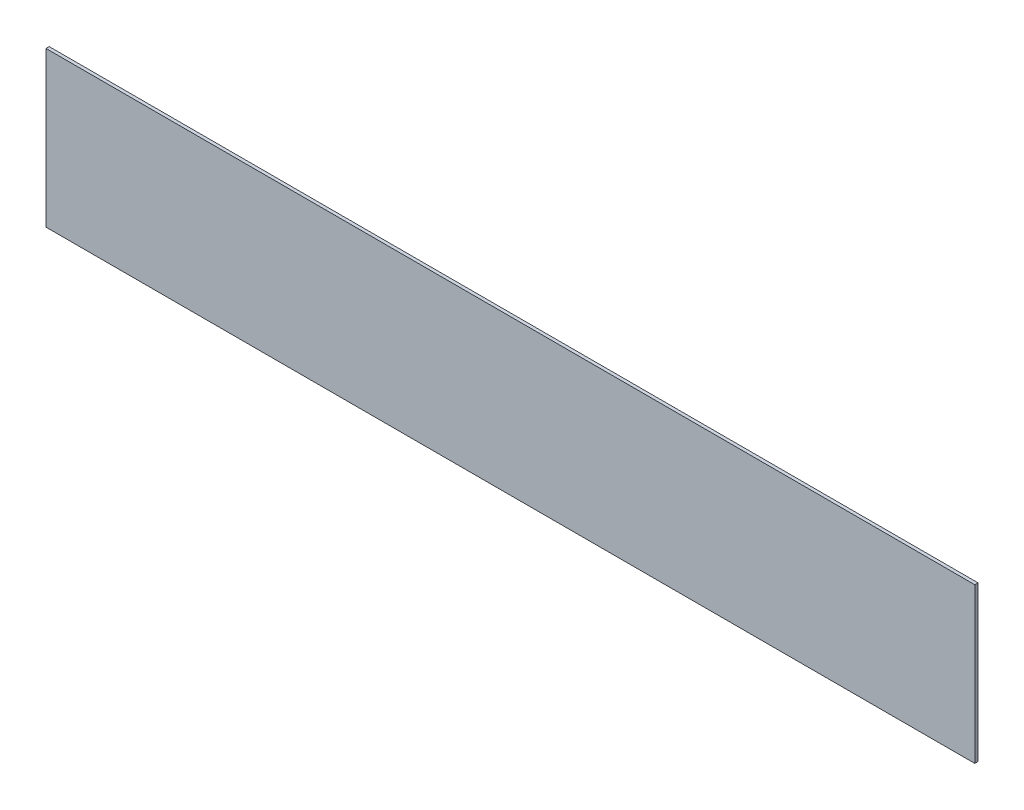
ISO-10303-21;
HEADER;
FILE_DESCRIPTION(('STEP AP214'),'2;1');
FILE_NAME('part.step','',(''),(''),'','','');
FILE_SCHEMA(('AUTOMOTIVE_DESIGN { 1 0 10303 214 1 1 1 1 }'));
ENDSEC;
DATA;
#1=APPLICATION_CONTEXT('core data for automotive mechanical design processes');
#2=APPLICATION_PROTOCOL_DEFINITION('international standard','automotive_design',2000,#1);
#3=PRODUCT_CONTEXT('',#1,'mechanical');
#4=PRODUCT('Part','Part','',(#3));
#5=PRODUCT_RELATED_PRODUCT_CATEGORY('part','',(#4));
#6=PRODUCT_DEFINITION_FORMATION('','',#4);
#7=PRODUCT_DEFINITION_CONTEXT('part definition',#1,'design');
#8=PRODUCT_DEFINITION('design','',#6,#7);
#9=PRODUCT_DEFINITION_SHAPE('','',#8);
#10=(LENGTH_UNIT() NAMED_UNIT(*) SI_UNIT(.MILLI.,.METRE.));
#11=(NAMED_UNIT(*) PLANE_ANGLE_UNIT() SI_UNIT($,.RADIAN.));
#12=(NAMED_UNIT(*) SI_UNIT($,.STERADIAN.) SOLID_ANGLE_UNIT());
#13=UNCERTAINTY_MEASURE_WITH_UNIT(LENGTH_MEASURE(1.E-05),#10,'distance_accuracy_value','');
#14=(GEOMETRIC_REPRESENTATION_CONTEXT(3) GLOBAL_UNCERTAINTY_ASSIGNED_CONTEXT((#13)) GLOBAL_UNIT_ASSIGNED_CONTEXT((#10,
#11,#12)) REPRESENTATION_CONTEXT('',''));
#15=CARTESIAN_POINT('',(0.,0.,0.));
#16=DIRECTION('',(0.,0.,1.));
#17=DIRECTION('',(1.,0.,0.));
#18=AXIS2_PLACEMENT_3D('',#15,#16,#17);
#19=CARTESIAN_POINT('',(0.,0.,3.175));
#20=DIRECTION('',(1.,0.,0.));
#21=DIRECTION('',(0.,0.,-1.));
#22=AXIS2_PLACEMENT_3D('',#19,#20,#21);
#23=PLANE('',#22);
#24=DIRECTION('',(0.,-1.,0.));
#25=VECTOR('',#24,1.);
#26=CARTESIAN_POINT('',(0.,0.,0.));
#27=LINE('',#26,#25);
#28=CARTESIAN_POINT('',(0.,152.4,0.));
#29=VERTEX_POINT('',#28);
#30=CARTESIAN_POINT('',(0.,0.,0.));
#31=VERTEX_POINT('',#30);
#32=EDGE_CURVE('E113',#29,#31,#27,.T.);
#33=ORIENTED_EDGE('',*,*,#32,.T.);
#34=DIRECTION('',(0.,0.,-1.));
#35=VECTOR('',#34,1.);
#36=CARTESIAN_POINT('',(0.,0.,3.175));
#37=LINE('',#36,#35);
#38=CARTESIAN_POINT('',(0.,0.,3.175));
#39=VERTEX_POINT('',#38);
#40=EDGE_CURVE('E11',#39,#31,#37,.T.);
#41=ORIENTED_EDGE('',*,*,#40,.F.);
#42=DIRECTION('',(0.,-1.,0.));
#43=VECTOR('',#42,1.);
#44=CARTESIAN_POINT('',(0.,0.,3.175));
#45=LINE('',#44,#43);
#46=CARTESIAN_POINT('',(0.,152.4,3.175));
#47=VERTEX_POINT('',#46);
#48=EDGE_CURVE('E97',#47,#39,#45,.T.);
#49=ORIENTED_EDGE('',*,*,#48,.F.);
#50=DIRECTION('',(0.,0.,-1.));
#51=VECTOR('',#50,1.);
#52=CARTESIAN_POINT('',(0.,152.4,3.175));
#53=LINE('',#52,#51);
#54=EDGE_CURVE('E109',#47,#29,#53,.T.);
#55=ORIENTED_EDGE('',*,*,#54,.T.);
#56=EDGE_LOOP('',(#33,#41,#49,#55));
#57=FACE_BOUND('',#56,.T.);
#58=ADVANCED_FACE('F45',(#57),#23,.F.);
#59=CARTESIAN_POINT('',(0.,0.,3.175));
#60=DIRECTION('',(0.,1.,0.));
#61=DIRECTION('',(0.,0.,1.));
#62=AXIS2_PLACEMENT_3D('',#59,#60,#61);
#63=PLANE('',#62);
#64=DIRECTION('',(1.,0.,0.));
#65=VECTOR('',#64,1.);
#66=CARTESIAN_POINT('',(0.,0.,0.));
#67=LINE('',#66,#65);
#68=CARTESIAN_POINT('',(914.4,0.,0.));
#69=VERTEX_POINT('',#68);
#70=EDGE_CURVE('E102',#31,#69,#67,.T.);
#71=ORIENTED_EDGE('',*,*,#70,.T.);
#72=DIRECTION('',(0.,0.,-1.));
#73=VECTOR('',#72,1.);
#74=CARTESIAN_POINT('',(914.4,0.,3.175));
#75=LINE('',#74,#73);
#76=CARTESIAN_POINT('',(914.4,0.,3.175));
#77=VERTEX_POINT('',#76);
#78=EDGE_CURVE('E54',#77,#69,#75,.T.);
#79=ORIENTED_EDGE('',*,*,#78,.F.);
#80=DIRECTION('',(1.,0.,0.));
#81=VECTOR('',#80,1.);
#82=CARTESIAN_POINT('',(0.,0.,3.175));
#83=LINE('',#82,#81);
#84=EDGE_CURVE('E92',#39,#77,#83,.T.);
#85=ORIENTED_EDGE('',*,*,#84,.F.);
#86=ORIENTED_EDGE('',*,*,#40,.T.);
#87=EDGE_LOOP('',(#71,#79,#85,#86));
#88=FACE_BOUND('',#87,.T.);
#89=ADVANCED_FACE('F101',(#88),#63,.F.);
#90=CARTESIAN_POINT('',(914.4,0.,3.175));
#91=DIRECTION('',(-1.,0.,0.));
#92=DIRECTION('',(0.,0.,1.));
#93=AXIS2_PLACEMENT_3D('',#90,#91,#92);
#94=PLANE('',#93);
#95=DIRECTION('',(0.,1.,0.));
#96=VECTOR('',#95,1.);
#97=CARTESIAN_POINT('',(914.4,0.,0.));
#98=LINE('',#97,#96);
#99=CARTESIAN_POINT('',(914.4,152.4,0.));
#100=VERTEX_POINT('',#99);
#101=EDGE_CURVE('E79',#69,#100,#98,.T.);
#102=ORIENTED_EDGE('',*,*,#101,.T.);
#103=DIRECTION('',(0.,0.,-1.));
#104=VECTOR('',#103,1.);
#105=CARTESIAN_POINT('',(914.4,152.4,3.175));
#106=LINE('',#105,#104);
#107=CARTESIAN_POINT('',(914.4,152.4,3.175));
#108=VERTEX_POINT('',#107);
#109=EDGE_CURVE('E104',#108,#100,#106,.T.);
#110=ORIENTED_EDGE('',*,*,#109,.F.);
#111=DIRECTION('',(0.,1.,0.));
#112=VECTOR('',#111,1.);
#113=CARTESIAN_POINT('',(914.4,0.,3.175));
#114=LINE('',#113,#112);
#115=EDGE_CURVE('E95',#77,#108,#114,.T.);
#116=ORIENTED_EDGE('',*,*,#115,.F.);
#117=ORIENTED_EDGE('',*,*,#78,.T.);
#118=EDGE_LOOP('',(#102,#110,#116,#117));
#119=FACE_BOUND('',#118,.T.);
#120=ADVANCED_FACE('F105',(#119),#94,.F.);
#121=CARTESIAN_POINT('',(0.,152.4,3.175));
#122=DIRECTION('',(0.,-1.,0.));
#123=DIRECTION('',(1.,0.,0.));
#124=AXIS2_PLACEMENT_3D('',#121,#122,#123);
#125=PLANE('',#124);
#126=DIRECTION('',(-1.,0.,0.));
#127=VECTOR('',#126,1.);
#128=CARTESIAN_POINT('',(0.,152.4,0.));
#129=LINE('',#128,#127);
#130=EDGE_CURVE('E85',#100,#29,#129,.T.);
#131=ORIENTED_EDGE('',*,*,#130,.T.);
#132=ORIENTED_EDGE('',*,*,#54,.F.);
#133=DIRECTION('',(-1.,0.,0.));
#134=VECTOR('',#133,1.);
#135=CARTESIAN_POINT('',(0.,152.4,3.175));
#136=LINE('',#135,#134);
#137=EDGE_CURVE('E62',#108,#47,#136,.T.);
#138=ORIENTED_EDGE('',*,*,#137,.F.);
#139=ORIENTED_EDGE('',*,*,#109,.T.);
#140=EDGE_LOOP('',(#131,#132,#138,#139));
#141=FACE_BOUND('',#140,.T.);
#142=ADVANCED_FACE('F126',(#141),#125,.F.);
#143=CARTESIAN_POINT('',(0.,0.,3.175));
#144=DIRECTION('',(0.,0.,-1.));
#145=DIRECTION('',(-1.,0.,0.));
#146=AXIS2_PLACEMENT_3D('',#143,#144,#145);
#147=PLANE('',#146);
#148=ORIENTED_EDGE('',*,*,#48,.T.);
#149=ORIENTED_EDGE('',*,*,#84,.T.);
#150=ORIENTED_EDGE('',*,*,#115,.T.);
#151=ORIENTED_EDGE('',*,*,#137,.T.);
#152=EDGE_LOOP('',(#148,#149,#150,#151));
#153=FACE_BOUND('',#152,.T.);
#154=ADVANCED_FACE('F93',(#153),#147,.F.);
#155=CARTESIAN_POINT('',(0.,0.,0.));
#156=DIRECTION('',(0.,0.,-1.));
#157=DIRECTION('',(-1.,0.,0.));
#158=AXIS2_PLACEMENT_3D('',#155,#156,#157);
#159=PLANE('',#158);
#160=ORIENTED_EDGE('',*,*,#32,.F.);
#161=ORIENTED_EDGE('',*,*,#130,.F.);
#162=ORIENTED_EDGE('',*,*,#101,.F.);
#163=ORIENTED_EDGE('',*,*,#70,.F.);
#164=EDGE_LOOP('',(#160,#161,#162,#163));
#165=FACE_BOUND('',#164,.T.);
#166=ADVANCED_FACE('F129',(#165),#159,.T.);
#167=CLOSED_SHELL('',(#58,#89,#120,#142,#154,#166));
#168=MANIFOLD_SOLID_BREP('B2',#167);
#169=ADVANCED_BREP_SHAPE_REPRESENTATION('',(#18,#168),#14);
#170=SHAPE_DEFINITION_REPRESENTATION(#9,#169);
ENDSEC;
END-ISO-10303-21;
